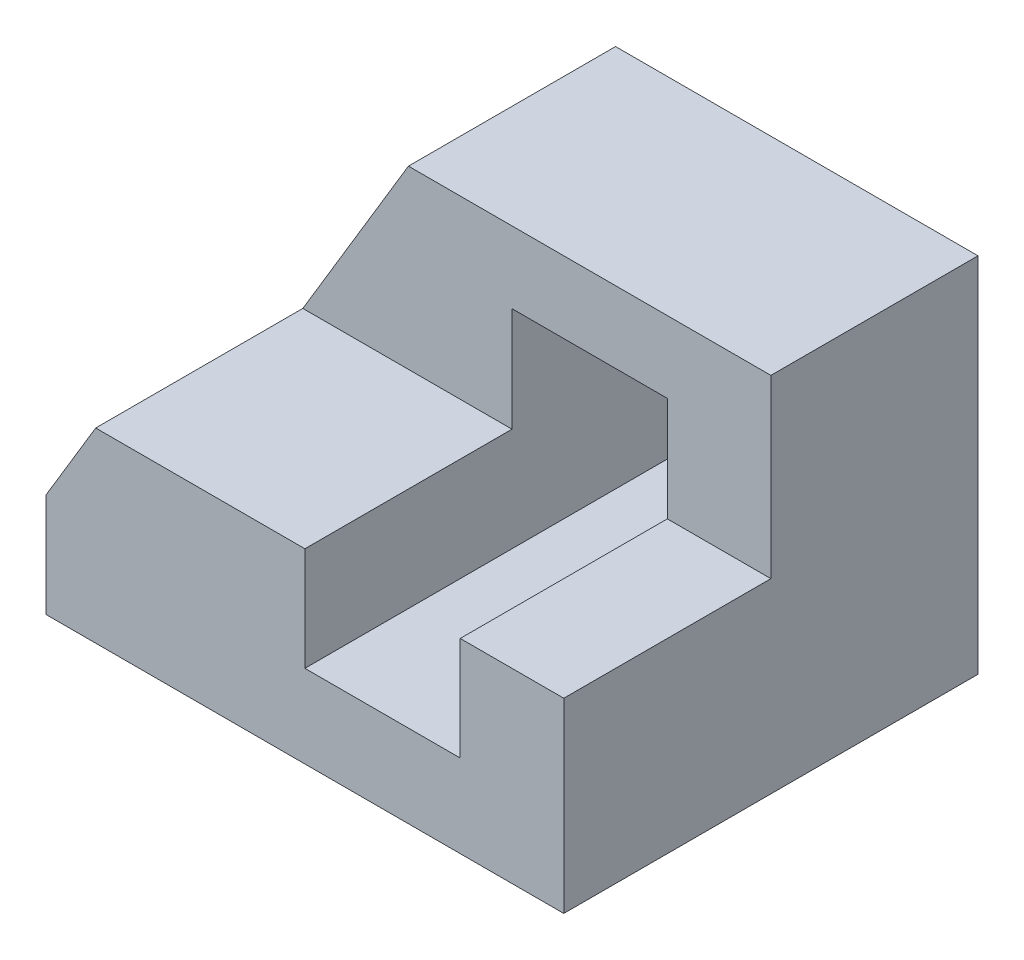
ISO-10303-21;
HEADER;
FILE_DESCRIPTION(('STEP AP214'),'2;1');
FILE_NAME('part.step','',(''),(''),'','','');
FILE_SCHEMA(('AUTOMOTIVE_DESIGN { 1 0 10303 214 1 1 1 1 }'));
ENDSEC;
DATA;
#1=APPLICATION_CONTEXT('core data for automotive mechanical design processes');
#2=APPLICATION_PROTOCOL_DEFINITION('international standard','automotive_design',2000,#1);
#3=PRODUCT_CONTEXT('',#1,'mechanical');
#4=PRODUCT('Part','Part','',(#3));
#5=PRODUCT_RELATED_PRODUCT_CATEGORY('part','',(#4));
#6=PRODUCT_DEFINITION_FORMATION('','',#4);
#7=PRODUCT_DEFINITION_CONTEXT('part definition',#1,'design');
#8=PRODUCT_DEFINITION('design','',#6,#7);
#9=PRODUCT_DEFINITION_SHAPE('','',#8);
#10=(LENGTH_UNIT() NAMED_UNIT(*) SI_UNIT(.MILLI.,.METRE.));
#11=(NAMED_UNIT(*) PLANE_ANGLE_UNIT() SI_UNIT($,.RADIAN.));
#12=(NAMED_UNIT(*) SI_UNIT($,.STERADIAN.) SOLID_ANGLE_UNIT());
#13=UNCERTAINTY_MEASURE_WITH_UNIT(LENGTH_MEASURE(1.E-05),#10,'distance_accuracy_value','');
#14=(GEOMETRIC_REPRESENTATION_CONTEXT(3) GLOBAL_UNCERTAINTY_ASSIGNED_CONTEXT((#13)) GLOBAL_UNIT_ASSIGNED_CONTEXT((#10,
#11,#12)) REPRESENTATION_CONTEXT('',''));
#15=CARTESIAN_POINT('',(0.,0.,0.));
#16=DIRECTION('',(0.,0.,1.));
#17=DIRECTION('',(1.,0.,0.));
#18=AXIS2_PLACEMENT_3D('',#15,#16,#17);
#19=CARTESIAN_POINT('',(0.,18.,40.));
#20=DIRECTION('',(0.,1.,0.));
#21=DIRECTION('',(0.,0.,1.));
#22=AXIS2_PLACEMENT_3D('',#19,#20,#21);
#23=PLANE('',#22);
#24=DIRECTION('',(1.,0.,0.));
#25=VECTOR('',#24,1.);
#26=CARTESIAN_POINT('',(0.,18.,20.));
#27=LINE('',#26,#25);
#28=CARTESIAN_POINT('',(40.,18.,20.));
#29=VERTEX_POINT('',#28);
#30=CARTESIAN_POINT('',(50.,18.,20.));
#31=VERTEX_POINT('',#30);
#32=EDGE_CURVE('E297',#29,#31,#27,.T.);
#33=ORIENTED_EDGE('',*,*,#32,.F.);
#34=DIRECTION('',(0.,0.,-1.));
#35=VECTOR('',#34,1.);
#36=CARTESIAN_POINT('',(40.,18.,40.));
#37=LINE('',#36,#35);
#38=CARTESIAN_POINT('',(40.,18.,40.));
#39=VERTEX_POINT('',#38);
#40=EDGE_CURVE('E11',#39,#29,#37,.T.);
#41=ORIENTED_EDGE('',*,*,#40,.F.);
#42=DIRECTION('',(1.,0.,0.));
#43=VECTOR('',#42,1.);
#44=CARTESIAN_POINT('',(0.,18.,40.));
#45=LINE('',#44,#43);
#46=CARTESIAN_POINT('',(50.,18.,40.));
#47=VERTEX_POINT('',#46);
#48=EDGE_CURVE('E169',#39,#47,#45,.T.);
#49=ORIENTED_EDGE('',*,*,#48,.T.);
#50=DIRECTION('',(0.,0.,-1.));
#51=VECTOR('',#50,1.);
#52=CARTESIAN_POINT('',(50.,18.,40.));
#53=LINE('',#52,#51);
#54=EDGE_CURVE('E141',#47,#31,#53,.T.);
#55=ORIENTED_EDGE('',*,*,#54,.T.);
#56=EDGE_LOOP('',(#33,#41,#49,#55));
#57=FACE_BOUND('',#56,.T.);
#58=ADVANCED_FACE('F47',(#57),#23,.T.);
#59=CARTESIAN_POINT('',(40.,0.,40.));
#60=DIRECTION('',(1.,0.,0.));
#61=DIRECTION('',(0.,1.,0.));
#62=AXIS2_PLACEMENT_3D('',#59,#60,#61);
#63=PLANE('',#62);
#64=DIRECTION('',(0.,-1.,0.));
#65=VECTOR('',#64,1.);
#66=CARTESIAN_POINT('',(40.,0.,0.));
#67=LINE('',#66,#65);
#68=CARTESIAN_POINT('',(40.,28.0786897432405,0.));
#69=VERTEX_POINT('',#68);
#70=CARTESIAN_POINT('',(40.,8.,0.));
#71=VERTEX_POINT('',#70);
#72=EDGE_CURVE('E145',#69,#71,#67,.T.);
#73=ORIENTED_EDGE('',*,*,#72,.T.);
#74=DIRECTION('',(0.,0.,-1.));
#75=VECTOR('',#74,1.);
#76=CARTESIAN_POINT('',(40.,8.,40.));
#77=LINE('',#76,#75);
#78=CARTESIAN_POINT('',(40.,8.,40.));
#79=VERTEX_POINT('',#78);
#80=EDGE_CURVE('E57',#79,#71,#77,.T.);
#81=ORIENTED_EDGE('',*,*,#80,.F.);
#82=DIRECTION('',(0.,-1.,0.));
#83=VECTOR('',#82,1.);
#84=CARTESIAN_POINT('',(40.,0.,40.));
#85=LINE('',#84,#83);
#86=EDGE_CURVE('E244',#39,#79,#85,.T.);
#87=ORIENTED_EDGE('',*,*,#86,.F.);
#88=ORIENTED_EDGE('',*,*,#40,.T.);
#89=DIRECTION('',(0.,-1.,0.));
#90=VECTOR('',#89,1.);
#91=CARTESIAN_POINT('',(40.,0.,20.));
#92=LINE('',#91,#90);
#93=CARTESIAN_POINT('',(40.,28.0786897432405,20.));
#94=VERTEX_POINT('',#93);
#95=EDGE_CURVE('E304',#94,#29,#92,.T.);
#96=ORIENTED_EDGE('',*,*,#95,.F.);
#97=DIRECTION('',(0.,0.,-1.));
#98=VECTOR('',#97,1.);
#99=CARTESIAN_POINT('',(40.,28.0786897432405,20.));
#100=LINE('',#99,#98);
#101=EDGE_CURVE('E150',#94,#69,#100,.T.);
#102=ORIENTED_EDGE('',*,*,#101,.T.);
#103=EDGE_LOOP('',(#73,#81,#87,#88,#96,#102));
#104=FACE_BOUND('',#103,.T.);
#105=ADVANCED_FACE('F49',(#104),#63,.F.);
#106=CARTESIAN_POINT('',(0.,7.99999999999999,40.));
#107=DIRECTION('',(0.,1.,0.));
#108=DIRECTION('',(-1.,0.,0.));
#109=AXIS2_PLACEMENT_3D('',#106,#107,#108);
#110=PLANE('',#109);
#111=DIRECTION('',(1.,0.,0.));
#112=VECTOR('',#111,1.);
#113=CARTESIAN_POINT('',(0.,7.99999999999999,0.));
#114=LINE('',#113,#112);
#115=CARTESIAN_POINT('',(25.,8.,0.));
#116=VERTEX_POINT('',#115);
#117=EDGE_CURVE('E149',#116,#71,#114,.T.);
#118=ORIENTED_EDGE('',*,*,#117,.F.);
#119=DIRECTION('',(0.,0.,-1.));
#120=VECTOR('',#119,1.);
#121=CARTESIAN_POINT('',(25.,8.,40.));
#122=LINE('',#121,#120);
#123=CARTESIAN_POINT('',(25.,8.,40.));
#124=VERTEX_POINT('',#123);
#125=EDGE_CURVE('E185',#124,#116,#122,.T.);
#126=ORIENTED_EDGE('',*,*,#125,.F.);
#127=DIRECTION('',(1.,0.,0.));
#128=VECTOR('',#127,1.);
#129=CARTESIAN_POINT('',(0.,7.99999999999999,40.));
#130=LINE('',#129,#128);
#131=EDGE_CURVE('E194',#124,#79,#130,.T.);
#132=ORIENTED_EDGE('',*,*,#131,.T.);
#133=ORIENTED_EDGE('',*,*,#80,.T.);
#134=EDGE_LOOP('',(#118,#126,#132,#133));
#135=FACE_BOUND('',#134,.T.);
#136=ADVANCED_FACE('F192',(#135),#110,.T.);
#137=CARTESIAN_POINT('',(25.,0.,40.));
#138=DIRECTION('',(1.,0.,0.));
#139=DIRECTION('',(0.,1.,0.));
#140=AXIS2_PLACEMENT_3D('',#137,#138,#139);
#141=PLANE('',#140);
#142=DIRECTION('',(0.,-1.,0.));
#143=VECTOR('',#142,1.);
#144=CARTESIAN_POINT('',(25.,0.,0.));
#145=LINE('',#144,#143);
#146=CARTESIAN_POINT('',(25.,28.0786897432405,0.));
#147=VERTEX_POINT('',#146);
#148=EDGE_CURVE('E154',#147,#116,#145,.T.);
#149=ORIENTED_EDGE('',*,*,#148,.F.);
#150=DIRECTION('',(0.,0.,-1.));
#151=VECTOR('',#150,1.);
#152=CARTESIAN_POINT('',(25.,28.0786897432405,20.));
#153=LINE('',#152,#151);
#154=CARTESIAN_POINT('',(25.,28.0786897432405,20.));
#155=VERTEX_POINT('',#154);
#156=EDGE_CURVE('E212',#155,#147,#153,.T.);
#157=ORIENTED_EDGE('',*,*,#156,.F.);
#158=DIRECTION('',(0.,-1.,0.));
#159=VECTOR('',#158,1.);
#160=CARTESIAN_POINT('',(25.,0.,20.));
#161=LINE('',#160,#159);
#162=CARTESIAN_POINT('',(25.,18.,20.));
#163=VERTEX_POINT('',#162);
#164=EDGE_CURVE('E224',#155,#163,#161,.T.);
#165=ORIENTED_EDGE('',*,*,#164,.T.);
#166=DIRECTION('',(0.,0.,-1.));
#167=VECTOR('',#166,1.);
#168=CARTESIAN_POINT('',(25.,18.,40.));
#169=LINE('',#168,#167);
#170=CARTESIAN_POINT('',(25.,18.,40.));
#171=VERTEX_POINT('',#170);
#172=EDGE_CURVE('E181',#171,#163,#169,.T.);
#173=ORIENTED_EDGE('',*,*,#172,.F.);
#174=DIRECTION('',(0.,-1.,0.));
#175=VECTOR('',#174,1.);
#176=CARTESIAN_POINT('',(25.,0.,40.));
#177=LINE('',#176,#175);
#178=EDGE_CURVE('E250',#171,#124,#177,.T.);
#179=ORIENTED_EDGE('',*,*,#178,.T.);
#180=ORIENTED_EDGE('',*,*,#125,.T.);
#181=EDGE_LOOP('',(#149,#157,#165,#173,#179,#180));
#182=FACE_BOUND('',#181,.T.);
#183=ADVANCED_FACE('F210',(#182),#141,.T.);
#184=CARTESIAN_POINT('',(4.8,18.,20.));
#185=VERTEX_POINT('',#184);
#186=EDGE_CURVE('E231',#185,#163,#27,.T.);
#187=ORIENTED_EDGE('',*,*,#186,.F.);
#188=DIRECTION('',(0.,0.,-1.));
#189=VECTOR('',#188,1.);
#190=CARTESIAN_POINT('',(4.8,18.,40.));
#191=LINE('',#190,#189);
#192=CARTESIAN_POINT('',(4.8,18.,40.));
#193=VERTEX_POINT('',#192);
#194=EDGE_CURVE('E177',#193,#185,#191,.T.);
#195=ORIENTED_EDGE('',*,*,#194,.F.);
#196=EDGE_CURVE('E245',#193,#171,#45,.T.);
#197=ORIENTED_EDGE('',*,*,#196,.T.);
#198=ORIENTED_EDGE('',*,*,#172,.T.);
#199=EDGE_LOOP('',(#187,#195,#197,#198));
#200=FACE_BOUND('',#199,.T.);
#201=ADVANCED_FACE('F257',(#200),#23,.T.);
#202=CARTESIAN_POINT('',(-4.41176470588235,2.64705882352941,40.));
#203=DIRECTION('',(0.857492925712544,-0.514495755427526,0.));
#204=DIRECTION('',(0.514495755427527,0.857492925712544,0.));
#205=AXIS2_PLACEMENT_3D('',#202,#203,#204);
#206=PLANE('',#205);
#207=DIRECTION('',(-0.514495755427527,-0.857492925712544,0.));
#208=VECTOR('',#207,1.);
#209=CARTESIAN_POINT('',(-4.41176470588235,2.64705882352941,0.));
#210=LINE('',#209,#208);
#211=CARTESIAN_POINT('',(15.,35.,0.));
#212=VERTEX_POINT('',#211);
#213=CARTESIAN_POINT('',(0.,10.,0.));
#214=VERTEX_POINT('',#213);
#215=EDGE_CURVE('E158',#212,#214,#210,.T.);
#216=ORIENTED_EDGE('',*,*,#215,.T.);
#217=DIRECTION('',(0.,0.,-1.));
#218=VECTOR('',#217,1.);
#219=CARTESIAN_POINT('',(0.,10.,40.));
#220=LINE('',#219,#218);
#221=CARTESIAN_POINT('',(0.,10.,40.));
#222=VERTEX_POINT('',#221);
#223=EDGE_CURVE('E134',#222,#214,#220,.T.);
#224=ORIENTED_EDGE('',*,*,#223,.F.);
#225=DIRECTION('',(-0.514495755427527,-0.857492925712544,0.));
#226=VECTOR('',#225,1.);
#227=CARTESIAN_POINT('',(-4.41176470588235,2.64705882352941,40.));
#228=LINE('',#227,#226);
#229=EDGE_CURVE('E127',#193,#222,#228,.T.);
#230=ORIENTED_EDGE('',*,*,#229,.F.);
#231=ORIENTED_EDGE('',*,*,#194,.T.);
#232=DIRECTION('',(-0.514495755427527,-0.857492925712544,0.));
#233=VECTOR('',#232,1.);
#234=CARTESIAN_POINT('',(-4.41176470588235,2.64705882352941,20.));
#235=LINE('',#234,#233);
#236=CARTESIAN_POINT('',(15.,35.,20.));
#237=VERTEX_POINT('',#236);
#238=EDGE_CURVE('E287',#237,#185,#235,.T.);
#239=ORIENTED_EDGE('',*,*,#238,.F.);
#240=DIRECTION('',(0.,0.,-1.));
#241=VECTOR('',#240,1.);
#242=CARTESIAN_POINT('',(15.,35.,20.));
#243=LINE('',#242,#241);
#244=EDGE_CURVE('E223',#237,#212,#243,.T.);
#245=ORIENTED_EDGE('',*,*,#244,.T.);
#246=EDGE_LOOP('',(#216,#224,#230,#231,#239,#245));
#247=FACE_BOUND('',#246,.T.);
#248=ADVANCED_FACE('F286',(#247),#206,.F.);
#249=CARTESIAN_POINT('',(0.,0.,40.));
#250=DIRECTION('',(1.,0.,0.));
#251=DIRECTION('',(0.,1.,0.));
#252=AXIS2_PLACEMENT_3D('',#249,#250,#251);
#253=PLANE('',#252);
#254=DIRECTION('',(0.,-1.,0.));
#255=VECTOR('',#254,1.);
#256=CARTESIAN_POINT('',(0.,0.,0.));
#257=LINE('',#256,#255);
#258=CARTESIAN_POINT('',(0.,0.,0.));
#259=VERTEX_POINT('',#258);
#260=EDGE_CURVE('E86',#214,#259,#257,.T.);
#261=ORIENTED_EDGE('',*,*,#260,.T.);
#262=DIRECTION('',(0.,0.,-1.));
#263=VECTOR('',#262,1.);
#264=CARTESIAN_POINT('',(0.,0.,40.));
#265=LINE('',#264,#263);
#266=CARTESIAN_POINT('',(0.,0.,40.));
#267=VERTEX_POINT('',#266);
#268=EDGE_CURVE('E131',#267,#259,#265,.T.);
#269=ORIENTED_EDGE('',*,*,#268,.F.);
#270=DIRECTION('',(0.,-1.,0.));
#271=VECTOR('',#270,1.);
#272=CARTESIAN_POINT('',(0.,0.,40.));
#273=LINE('',#272,#271);
#274=EDGE_CURVE('E121',#222,#267,#273,.T.);
#275=ORIENTED_EDGE('',*,*,#274,.F.);
#276=ORIENTED_EDGE('',*,*,#223,.T.);
#277=EDGE_LOOP('',(#261,#269,#275,#276));
#278=FACE_BOUND('',#277,.T.);
#279=ADVANCED_FACE('F132',(#278),#253,.F.);
#280=CARTESIAN_POINT('',(0.,0.,40.));
#281=DIRECTION('',(0.,1.,0.));
#282=DIRECTION('',(0.,0.,1.));
#283=AXIS2_PLACEMENT_3D('',#280,#281,#282);
#284=PLANE('',#283);
#285=DIRECTION('',(1.,0.,0.));
#286=VECTOR('',#285,1.);
#287=CARTESIAN_POINT('',(0.,0.,0.));
#288=LINE('',#287,#286);
#289=CARTESIAN_POINT('',(50.,0.,0.));
#290=VERTEX_POINT('',#289);
#291=EDGE_CURVE('E93',#259,#290,#288,.T.);
#292=ORIENTED_EDGE('',*,*,#291,.T.);
#293=DIRECTION('',(0.,0.,-1.));
#294=VECTOR('',#293,1.);
#295=CARTESIAN_POINT('',(50.,0.,40.));
#296=LINE('',#295,#294);
#297=CARTESIAN_POINT('',(50.,0.,40.));
#298=VERTEX_POINT('',#297);
#299=EDGE_CURVE('E135',#298,#290,#296,.T.);
#300=ORIENTED_EDGE('',*,*,#299,.F.);
#301=DIRECTION('',(1.,0.,0.));
#302=VECTOR('',#301,1.);
#303=CARTESIAN_POINT('',(0.,0.,40.));
#304=LINE('',#303,#302);
#305=EDGE_CURVE('E124',#267,#298,#304,.T.);
#306=ORIENTED_EDGE('',*,*,#305,.F.);
#307=ORIENTED_EDGE('',*,*,#268,.T.);
#308=EDGE_LOOP('',(#292,#300,#306,#307));
#309=FACE_BOUND('',#308,.T.);
#310=ADVANCED_FACE('F137',(#309),#284,.F.);
#311=CARTESIAN_POINT('',(50.,0.,40.));
#312=DIRECTION('',(-1.,0.,0.));
#313=DIRECTION('',(0.,0.,1.));
#314=AXIS2_PLACEMENT_3D('',#311,#312,#313);
#315=PLANE('',#314);
#316=DIRECTION('',(0.,1.,0.));
#317=VECTOR('',#316,1.);
#318=CARTESIAN_POINT('',(50.,0.,0.));
#319=LINE('',#318,#317);
#320=CARTESIAN_POINT('',(50.,35.,0.));
#321=VERTEX_POINT('',#320);
#322=EDGE_CURVE('E165',#290,#321,#319,.T.);
#323=ORIENTED_EDGE('',*,*,#322,.T.);
#324=DIRECTION('',(0.,0.,-1.));
#325=VECTOR('',#324,1.);
#326=CARTESIAN_POINT('',(50.,35.,20.));
#327=LINE('',#326,#325);
#328=CARTESIAN_POINT('',(50.,35.,20.));
#329=VERTEX_POINT('',#328);
#330=EDGE_CURVE('E229',#329,#321,#327,.T.);
#331=ORIENTED_EDGE('',*,*,#330,.F.);
#332=DIRECTION('',(0.,1.,0.));
#333=VECTOR('',#332,1.);
#334=CARTESIAN_POINT('',(50.,0.,20.));
#335=LINE('',#334,#333);
#336=EDGE_CURVE('E298',#31,#329,#335,.T.);
#337=ORIENTED_EDGE('',*,*,#336,.F.);
#338=ORIENTED_EDGE('',*,*,#54,.F.);
#339=DIRECTION('',(0.,1.,0.));
#340=VECTOR('',#339,1.);
#341=CARTESIAN_POINT('',(50.,0.,40.));
#342=LINE('',#341,#340);
#343=EDGE_CURVE('E65',#298,#47,#342,.T.);
#344=ORIENTED_EDGE('',*,*,#343,.F.);
#345=ORIENTED_EDGE('',*,*,#299,.T.);
#346=EDGE_LOOP('',(#323,#331,#337,#338,#344,#345));
#347=FACE_BOUND('',#346,.T.);
#348=ADVANCED_FACE('F315',(#347),#315,.F.);
#349=CARTESIAN_POINT('',(0.,0.,40.));
#350=DIRECTION('',(0.,0.,1.));
#351=DIRECTION('',(1.,0.,0.));
#352=AXIS2_PLACEMENT_3D('',#349,#350,#351);
#353=PLANE('',#352);
#354=ORIENTED_EDGE('',*,*,#48,.F.);
#355=ORIENTED_EDGE('',*,*,#86,.T.);
#356=ORIENTED_EDGE('',*,*,#131,.F.);
#357=ORIENTED_EDGE('',*,*,#178,.F.);
#358=ORIENTED_EDGE('',*,*,#196,.F.);
#359=ORIENTED_EDGE('',*,*,#229,.T.);
#360=ORIENTED_EDGE('',*,*,#274,.T.);
#361=ORIENTED_EDGE('',*,*,#305,.T.);
#362=ORIENTED_EDGE('',*,*,#343,.T.);
#363=EDGE_LOOP('',(#354,#355,#356,#357,#358,#359,#360,#361,#362));
#364=FACE_BOUND('',#363,.T.);
#365=ADVANCED_FACE('F122',(#364),#353,.T.);
#366=CARTESIAN_POINT('',(0.,0.,0.));
#367=DIRECTION('',(0.,0.,1.));
#368=DIRECTION('',(1.,0.,0.));
#369=AXIS2_PLACEMENT_3D('',#366,#367,#368);
#370=PLANE('',#369);
#371=DIRECTION('',(-1.,0.,0.));
#372=VECTOR('',#371,1.);
#373=CARTESIAN_POINT('',(0.,35.,0.));
#374=LINE('',#373,#372);
#375=EDGE_CURVE('E234',#321,#212,#374,.T.);
#376=ORIENTED_EDGE('',*,*,#375,.F.);
#377=ORIENTED_EDGE('',*,*,#322,.F.);
#378=ORIENTED_EDGE('',*,*,#291,.F.);
#379=ORIENTED_EDGE('',*,*,#260,.F.);
#380=ORIENTED_EDGE('',*,*,#215,.F.);
#381=EDGE_LOOP('',(#376,#377,#378,#379,#380));
#382=FACE_BOUND('',#381,.T.);
#383=ORIENTED_EDGE('',*,*,#72,.F.);
#384=DIRECTION('',(1.,0.,0.));
#385=VECTOR('',#384,1.);
#386=CARTESIAN_POINT('',(0.,28.0786897432405,0.));
#387=LINE('',#386,#385);
#388=EDGE_CURVE('E206',#147,#69,#387,.T.);
#389=ORIENTED_EDGE('',*,*,#388,.F.);
#390=ORIENTED_EDGE('',*,*,#148,.T.);
#391=ORIENTED_EDGE('',*,*,#117,.T.);
#392=EDGE_LOOP('',(#383,#389,#390,#391));
#393=FACE_BOUND('',#392,.T.);
#394=ADVANCED_FACE('F204',(#382,#393),#370,.F.);
#395=CARTESIAN_POINT('',(0.,28.0786897432405,20.));
#396=DIRECTION('',(0.,1.,0.));
#397=DIRECTION('',(-1.,0.,0.));
#398=AXIS2_PLACEMENT_3D('',#395,#396,#397);
#399=PLANE('',#398);
#400=ORIENTED_EDGE('',*,*,#388,.T.);
#401=ORIENTED_EDGE('',*,*,#101,.F.);
#402=DIRECTION('',(1.,0.,0.));
#403=VECTOR('',#402,1.);
#404=CARTESIAN_POINT('',(0.,28.0786897432405,20.));
#405=LINE('',#404,#403);
#406=EDGE_CURVE('E220',#155,#94,#405,.T.);
#407=ORIENTED_EDGE('',*,*,#406,.F.);
#408=ORIENTED_EDGE('',*,*,#156,.T.);
#409=EDGE_LOOP('',(#400,#401,#407,#408));
#410=FACE_BOUND('',#409,.T.);
#411=ADVANCED_FACE('F218',(#410),#399,.F.);
#412=CARTESIAN_POINT('',(0.,35.,20.));
#413=DIRECTION('',(0.,-1.,0.));
#414=DIRECTION('',(1.,0.,0.));
#415=AXIS2_PLACEMENT_3D('',#412,#413,#414);
#416=PLANE('',#415);
#417=ORIENTED_EDGE('',*,*,#375,.T.);
#418=ORIENTED_EDGE('',*,*,#244,.F.);
#419=DIRECTION('',(-1.,0.,0.));
#420=VECTOR('',#419,1.);
#421=CARTESIAN_POINT('',(0.,35.,20.));
#422=LINE('',#421,#420);
#423=EDGE_CURVE('E292',#329,#237,#422,.T.);
#424=ORIENTED_EDGE('',*,*,#423,.F.);
#425=ORIENTED_EDGE('',*,*,#330,.T.);
#426=EDGE_LOOP('',(#417,#418,#424,#425));
#427=FACE_BOUND('',#426,.T.);
#428=ADVANCED_FACE('F280',(#427),#416,.F.);
#429=CARTESIAN_POINT('',(0.,0.,20.));
#430=DIRECTION('',(0.,0.,1.));
#431=DIRECTION('',(1.,0.,0.));
#432=AXIS2_PLACEMENT_3D('',#429,#430,#431);
#433=PLANE('',#432);
#434=ORIENTED_EDGE('',*,*,#406,.T.);
#435=ORIENTED_EDGE('',*,*,#95,.T.);
#436=ORIENTED_EDGE('',*,*,#32,.T.);
#437=ORIENTED_EDGE('',*,*,#336,.T.);
#438=ORIENTED_EDGE('',*,*,#423,.T.);
#439=ORIENTED_EDGE('',*,*,#238,.T.);
#440=ORIENTED_EDGE('',*,*,#186,.T.);
#441=ORIENTED_EDGE('',*,*,#164,.F.);
#442=EDGE_LOOP('',(#434,#435,#436,#437,#438,#439,#440,#441));
#443=FACE_BOUND('',#442,.T.);
#444=ADVANCED_FACE('F264',(#443),#433,.T.);
#445=CLOSED_SHELL('',(#58,#105,#136,#183,#201,#248,#279,#310,#348,#365,#394,#411,#428,#444));
#446=MANIFOLD_SOLID_BREP('B2',#445);
#447=ADVANCED_BREP_SHAPE_REPRESENTATION('',(#18,#446),#14);
#448=SHAPE_DEFINITION_REPRESENTATION(#9,#447);
ENDSEC;
END-ISO-10303-21;
